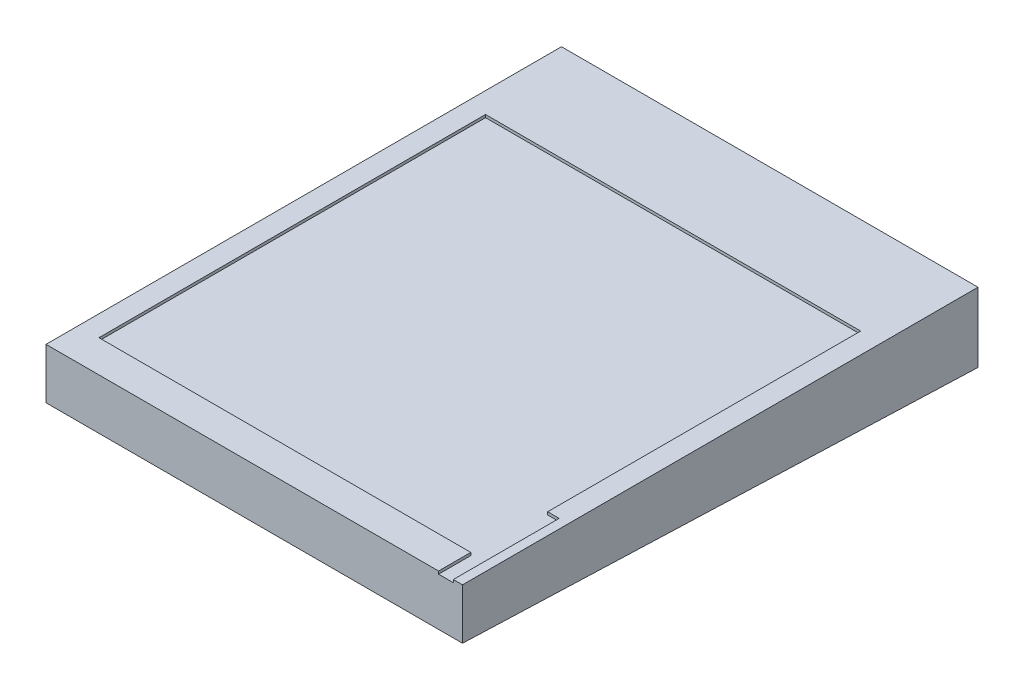
ISO-10303-21;
HEADER;
FILE_DESCRIPTION(('STEP AP214'),'2;1');
FILE_NAME('part.step','',(''),(''),'','','');
FILE_SCHEMA(('AUTOMOTIVE_DESIGN { 1 0 10303 214 1 1 1 1 }'));
ENDSEC;
DATA;
#1=APPLICATION_CONTEXT('core data for automotive mechanical design processes');
#2=APPLICATION_PROTOCOL_DEFINITION('international standard','automotive_design',2000,#1);
#3=PRODUCT_CONTEXT('',#1,'mechanical');
#4=PRODUCT('Part','Part','',(#3));
#5=PRODUCT_RELATED_PRODUCT_CATEGORY('part','',(#4));
#6=PRODUCT_DEFINITION_FORMATION('','',#4);
#7=PRODUCT_DEFINITION_CONTEXT('part definition',#1,'design');
#8=PRODUCT_DEFINITION('design','',#6,#7);
#9=PRODUCT_DEFINITION_SHAPE('','',#8);
#10=(LENGTH_UNIT() NAMED_UNIT(*) SI_UNIT(.MILLI.,.METRE.));
#11=(NAMED_UNIT(*) PLANE_ANGLE_UNIT() SI_UNIT($,.RADIAN.));
#12=(NAMED_UNIT(*) SI_UNIT($,.STERADIAN.) SOLID_ANGLE_UNIT());
#13=UNCERTAINTY_MEASURE_WITH_UNIT(LENGTH_MEASURE(1.E-05),#10,'distance_accuracy_value','');
#14=(GEOMETRIC_REPRESENTATION_CONTEXT(3) GLOBAL_UNCERTAINTY_ASSIGNED_CONTEXT((#13)) GLOBAL_UNIT_ASSIGNED_CONTEXT((#10,
#11,#12)) REPRESENTATION_CONTEXT('',''));
#15=CARTESIAN_POINT('',(0.,0.,0.));
#16=DIRECTION('',(0.,0.,1.));
#17=DIRECTION('',(1.,0.,0.));
#18=AXIS2_PLACEMENT_3D('',#15,#16,#17);
#19=CARTESIAN_POINT('',(90.5,0.,112.));
#20=DIRECTION('',(0.,-1.,0.));
#21=DIRECTION('',(0.,0.,-1.));
#22=AXIS2_PLACEMENT_3D('',#19,#20,#21);
#23=PLANE('',#22);
#24=DIRECTION('',(-1.,0.,0.));
#25=VECTOR('',#24,1.);
#26=CARTESIAN_POINT('',(90.5,0.,112.));
#27=LINE('',#26,#25);
#28=CARTESIAN_POINT('',(85.3,0.,112.));
#29=VERTEX_POINT('',#28);
#30=CARTESIAN_POINT('',(0.,0.,112.));
#31=VERTEX_POINT('',#30);
#32=EDGE_CURVE('E50',#29,#31,#27,.T.);
#33=ORIENTED_EDGE('',*,*,#32,.F.);
#34=DIRECTION('',(0.,0.,1.));
#35=VECTOR('',#34,1.);
#36=CARTESIAN_POINT('',(85.3,0.,112.));
#37=LINE('',#36,#35);
#38=CARTESIAN_POINT('',(85.3,0.,105.));
#39=VERTEX_POINT('',#38);
#40=EDGE_CURVE('E164',#39,#29,#37,.T.);
#41=ORIENTED_EDGE('',*,*,#40,.F.);
#42=DIRECTION('',(1.,0.,0.));
#43=VECTOR('',#42,1.);
#44=CARTESIAN_POINT('',(4.50000000000001,0.,105.));
#45=LINE('',#44,#43);
#46=CARTESIAN_POINT('',(4.50000000000002,0.,105.));
#47=VERTEX_POINT('',#46);
#48=EDGE_CURVE('E195',#47,#39,#45,.T.);
#49=ORIENTED_EDGE('',*,*,#48,.F.);
#50=DIRECTION('',(0.,0.,1.));
#51=VECTOR('',#50,1.);
#52=CARTESIAN_POINT('',(4.5,0.,21.));
#53=LINE('',#52,#51);
#54=CARTESIAN_POINT('',(4.5,0.,21.));
#55=VERTEX_POINT('',#54);
#56=EDGE_CURVE('E57',#55,#47,#53,.T.);
#57=ORIENTED_EDGE('',*,*,#56,.F.);
#58=DIRECTION('',(-1.,0.,0.));
#59=VECTOR('',#58,1.);
#60=CARTESIAN_POINT('',(4.5,0.,21.));
#61=LINE('',#60,#59);
#62=CARTESIAN_POINT('',(86.,0.,21.));
#63=VERTEX_POINT('',#62);
#64=EDGE_CURVE('E185',#63,#55,#61,.T.);
#65=ORIENTED_EDGE('',*,*,#64,.F.);
#66=DIRECTION('',(0.,0.,-1.));
#67=VECTOR('',#66,1.);
#68=CARTESIAN_POINT('',(86.,0.,21.));
#69=LINE('',#68,#67);
#70=CARTESIAN_POINT('',(86.,0.,89.));
#71=VERTEX_POINT('',#70);
#72=EDGE_CURVE('E198',#71,#63,#69,.T.);
#73=ORIENTED_EDGE('',*,*,#72,.F.);
#74=DIRECTION('',(-1.,0.,0.));
#75=VECTOR('',#74,1.);
#76=CARTESIAN_POINT('',(88.5,0.,89.));
#77=LINE('',#76,#75);
#78=CARTESIAN_POINT('',(88.5,0.,89.));
#79=VERTEX_POINT('',#78);
#80=EDGE_CURVE('E166',#79,#71,#77,.T.);
#81=ORIENTED_EDGE('',*,*,#80,.F.);
#82=DIRECTION('',(0.,0.,-1.));
#83=VECTOR('',#82,1.);
#84=CARTESIAN_POINT('',(88.5,0.,112.));
#85=LINE('',#84,#83);
#86=CARTESIAN_POINT('',(88.5,0.,112.));
#87=VERTEX_POINT('',#86);
#88=EDGE_CURVE('E146',#87,#79,#85,.T.);
#89=ORIENTED_EDGE('',*,*,#88,.F.);
#90=CARTESIAN_POINT('',(90.5,0.,112.));
#91=VERTEX_POINT('',#90);
#92=EDGE_CURVE('E11',#91,#87,#27,.T.);
#93=ORIENTED_EDGE('',*,*,#92,.F.);
#94=DIRECTION('',(0.,0.,1.));
#95=VECTOR('',#94,1.);
#96=CARTESIAN_POINT('',(90.5,0.,112.));
#97=LINE('',#96,#95);
#98=CARTESIAN_POINT('',(90.5,0.,0.));
#99=VERTEX_POINT('',#98);
#100=EDGE_CURVE('E209',#99,#91,#97,.T.);
#101=ORIENTED_EDGE('',*,*,#100,.F.);
#102=DIRECTION('',(-1.,0.,0.));
#103=VECTOR('',#102,1.);
#104=CARTESIAN_POINT('',(90.5,0.,0.));
#105=LINE('',#104,#103);
#106=CARTESIAN_POINT('',(0.,0.,0.));
#107=VERTEX_POINT('',#106);
#108=EDGE_CURVE('E215',#99,#107,#105,.T.);
#109=ORIENTED_EDGE('',*,*,#108,.T.);
#110=DIRECTION('',(0.,0.,1.));
#111=VECTOR('',#110,1.);
#112=CARTESIAN_POINT('',(0.,0.,112.));
#113=LINE('',#112,#111);
#114=EDGE_CURVE('E204',#107,#31,#113,.T.);
#115=ORIENTED_EDGE('',*,*,#114,.T.);
#116=EDGE_LOOP('',(#33,#41,#49,#57,#65,#73,#81,#89,#93,#101,#109,#115));
#117=FACE_BOUND('',#116,.T.);
#118=ADVANCED_FACE('F43',(#117),#23,.F.);
#119=CARTESIAN_POINT('',(90.5,-11.,112.));
#120=DIRECTION('',(0.,0.,-1.));
#121=DIRECTION('',(-1.,0.,0.));
#122=AXIS2_PLACEMENT_3D('',#119,#120,#121);
#123=PLANE('',#122);
#124=ORIENTED_EDGE('',*,*,#92,.T.);
#125=DIRECTION('',(0.,1.,0.));
#126=VECTOR('',#125,1.);
#127=CARTESIAN_POINT('',(88.5,-0.6,112.));
#128=LINE('',#127,#126);
#129=CARTESIAN_POINT('',(88.5,-0.6,112.));
#130=VERTEX_POINT('',#129);
#131=EDGE_CURVE('E173',#130,#87,#128,.T.);
#132=ORIENTED_EDGE('',*,*,#131,.F.);
#133=DIRECTION('',(1.,0.,0.));
#134=VECTOR('',#133,1.);
#135=CARTESIAN_POINT('',(88.5,-0.6,112.));
#136=LINE('',#135,#134);
#137=CARTESIAN_POINT('',(85.3,-0.6,112.));
#138=VERTEX_POINT('',#137);
#139=EDGE_CURVE('E150',#138,#130,#136,.T.);
#140=ORIENTED_EDGE('',*,*,#139,.F.);
#141=DIRECTION('',(0.,1.,0.));
#142=VECTOR('',#141,1.);
#143=CARTESIAN_POINT('',(85.3,-0.6,112.));
#144=LINE('',#143,#142);
#145=EDGE_CURVE('E149',#138,#29,#144,.T.);
#146=ORIENTED_EDGE('',*,*,#145,.T.);
#147=ORIENTED_EDGE('',*,*,#32,.T.);
#148=DIRECTION('',(0.,-1.,0.));
#149=VECTOR('',#148,1.);
#150=CARTESIAN_POINT('',(0.,-11.,112.));
#151=LINE('',#150,#149);
#152=CARTESIAN_POINT('',(0.,-11.,112.));
#153=VERTEX_POINT('',#152);
#154=EDGE_CURVE('E218',#31,#153,#151,.T.);
#155=ORIENTED_EDGE('',*,*,#154,.T.);
#156=DIRECTION('',(-1.,0.,0.));
#157=VECTOR('',#156,1.);
#158=CARTESIAN_POINT('',(90.5,-11.,112.));
#159=LINE('',#158,#157);
#160=CARTESIAN_POINT('',(90.5,-11.,112.));
#161=VERTEX_POINT('',#160);
#162=EDGE_CURVE('E225',#161,#153,#159,.T.);
#163=ORIENTED_EDGE('',*,*,#162,.F.);
#164=DIRECTION('',(0.,-1.,0.));
#165=VECTOR('',#164,1.);
#166=CARTESIAN_POINT('',(90.5,-11.,112.));
#167=LINE('',#166,#165);
#168=EDGE_CURVE('E94',#91,#161,#167,.T.);
#169=ORIENTED_EDGE('',*,*,#168,.F.);
#170=EDGE_LOOP('',(#124,#132,#140,#146,#147,#155,#163,#169));
#171=FACE_BOUND('',#170,.T.);
#172=ADVANCED_FACE('F232',(#171),#123,.F.);
#173=CARTESIAN_POINT('',(90.5,-15.1,0.));
#174=DIRECTION('',(0.,0.999330631228077,-0.036582639178885));
#175=DIRECTION('',(0.,0.036582639178885,0.999330631228077));
#176=AXIS2_PLACEMENT_3D('',#173,#174,#175);
#177=PLANE('',#176);
#178=DIRECTION('',(0.,-0.036582639178885,-0.999330631228077));
#179=VECTOR('',#178,1.);
#180=CARTESIAN_POINT('',(0.,-15.1,0.));
#181=LINE('',#180,#179);
#182=CARTESIAN_POINT('',(0.,-15.1,0.));
#183=VERTEX_POINT('',#182);
#184=EDGE_CURVE('E220',#153,#183,#181,.T.);
#185=ORIENTED_EDGE('',*,*,#184,.T.);
#186=DIRECTION('',(-1.,0.,0.));
#187=VECTOR('',#186,1.);
#188=CARTESIAN_POINT('',(90.5,-15.1,0.));
#189=LINE('',#188,#187);
#190=CARTESIAN_POINT('',(90.5,-15.1,0.));
#191=VERTEX_POINT('',#190);
#192=EDGE_CURVE('E224',#191,#183,#189,.T.);
#193=ORIENTED_EDGE('',*,*,#192,.F.);
#194=DIRECTION('',(0.,-0.036582639178885,-0.999330631228077));
#195=VECTOR('',#194,1.);
#196=CARTESIAN_POINT('',(90.5,-15.1,0.));
#197=LINE('',#196,#195);
#198=EDGE_CURVE('E212',#161,#191,#197,.T.);
#199=ORIENTED_EDGE('',*,*,#198,.F.);
#200=ORIENTED_EDGE('',*,*,#162,.T.);
#201=EDGE_LOOP('',(#185,#193,#199,#200));
#202=FACE_BOUND('',#201,.T.);
#203=ADVANCED_FACE('F243',(#202),#177,.F.);
#204=CARTESIAN_POINT('',(90.5,0.,0.));
#205=DIRECTION('',(0.,0.,1.));
#206=DIRECTION('',(1.,0.,0.));
#207=AXIS2_PLACEMENT_3D('',#204,#205,#206);
#208=PLANE('',#207);
#209=DIRECTION('',(0.,1.,0.));
#210=VECTOR('',#209,1.);
#211=CARTESIAN_POINT('',(0.,0.,0.));
#212=LINE('',#211,#210);
#213=EDGE_CURVE('E87',#183,#107,#212,.T.);
#214=ORIENTED_EDGE('',*,*,#213,.T.);
#215=ORIENTED_EDGE('',*,*,#108,.F.);
#216=DIRECTION('',(0.,1.,0.));
#217=VECTOR('',#216,1.);
#218=CARTESIAN_POINT('',(90.5,0.,0.));
#219=LINE('',#218,#217);
#220=EDGE_CURVE('E66',#191,#99,#219,.T.);
#221=ORIENTED_EDGE('',*,*,#220,.F.);
#222=ORIENTED_EDGE('',*,*,#192,.T.);
#223=EDGE_LOOP('',(#214,#215,#221,#222));
#224=FACE_BOUND('',#223,.T.);
#225=ADVANCED_FACE('F241',(#224),#208,.F.);
#226=CARTESIAN_POINT('',(90.5,0.,0.));
#227=DIRECTION('',(-1.,0.,0.));
#228=DIRECTION('',(0.,0.,1.));
#229=AXIS2_PLACEMENT_3D('',#226,#227,#228);
#230=PLANE('',#229);
#231=ORIENTED_EDGE('',*,*,#100,.T.);
#232=ORIENTED_EDGE('',*,*,#168,.T.);
#233=ORIENTED_EDGE('',*,*,#198,.T.);
#234=ORIENTED_EDGE('',*,*,#220,.T.);
#235=EDGE_LOOP('',(#231,#232,#233,#234));
#236=FACE_BOUND('',#235,.T.);
#237=ADVANCED_FACE('F244',(#236),#230,.F.);
#238=CARTESIAN_POINT('',(0.,0.,0.));
#239=DIRECTION('',(-1.,0.,0.));
#240=DIRECTION('',(0.,0.,1.));
#241=AXIS2_PLACEMENT_3D('',#238,#239,#240);
#242=PLANE('',#241);
#243=ORIENTED_EDGE('',*,*,#114,.F.);
#244=ORIENTED_EDGE('',*,*,#213,.F.);
#245=ORIENTED_EDGE('',*,*,#184,.F.);
#246=ORIENTED_EDGE('',*,*,#154,.F.);
#247=EDGE_LOOP('',(#243,#244,#245,#246));
#248=FACE_BOUND('',#247,.T.);
#249=ADVANCED_FACE('F238',(#248),#242,.T.);
#250=CARTESIAN_POINT('',(4.5,-0.6,21.));
#251=DIRECTION('',(-1.,0.,0.));
#252=DIRECTION('',(0.,0.,1.));
#253=AXIS2_PLACEMENT_3D('',#250,#251,#252);
#254=PLANE('',#253);
#255=ORIENTED_EDGE('',*,*,#56,.T.);
#256=DIRECTION('',(0.,1.,0.));
#257=VECTOR('',#256,1.);
#258=CARTESIAN_POINT('',(4.50000000000001,-0.6,105.));
#259=LINE('',#258,#257);
#260=CARTESIAN_POINT('',(4.50000000000001,-0.6,105.));
#261=VERTEX_POINT('',#260);
#262=EDGE_CURVE('E193',#261,#47,#259,.T.);
#263=ORIENTED_EDGE('',*,*,#262,.F.);
#264=DIRECTION('',(0.,0.,1.));
#265=VECTOR('',#264,1.);
#266=CARTESIAN_POINT('',(4.5,-0.6,21.));
#267=LINE('',#266,#265);
#268=CARTESIAN_POINT('',(4.5,-0.6,21.));
#269=VERTEX_POINT('',#268);
#270=EDGE_CURVE('E181',#269,#261,#267,.T.);
#271=ORIENTED_EDGE('',*,*,#270,.F.);
#272=DIRECTION('',(0.,1.,0.));
#273=VECTOR('',#272,1.);
#274=CARTESIAN_POINT('',(4.5,-0.6,21.));
#275=LINE('',#274,#273);
#276=EDGE_CURVE('E202',#269,#55,#275,.T.);
#277=ORIENTED_EDGE('',*,*,#276,.T.);
#278=EDGE_LOOP('',(#255,#263,#271,#277));
#279=FACE_BOUND('',#278,.T.);
#280=ADVANCED_FACE('F254',(#279),#254,.F.);
#281=CARTESIAN_POINT('',(4.5,-0.6,21.));
#282=DIRECTION('',(0.,0.,-1.));
#283=DIRECTION('',(-1.,0.,0.));
#284=AXIS2_PLACEMENT_3D('',#281,#282,#283);
#285=PLANE('',#284);
#286=ORIENTED_EDGE('',*,*,#64,.T.);
#287=ORIENTED_EDGE('',*,*,#276,.F.);
#288=DIRECTION('',(-1.,0.,0.));
#289=VECTOR('',#288,1.);
#290=CARTESIAN_POINT('',(4.5,-0.6,21.));
#291=LINE('',#290,#289);
#292=CARTESIAN_POINT('',(86.,-0.6,21.));
#293=VERTEX_POINT('',#292);
#294=EDGE_CURVE('E190',#293,#269,#291,.T.);
#295=ORIENTED_EDGE('',*,*,#294,.F.);
#296=DIRECTION('',(0.,1.,0.));
#297=VECTOR('',#296,1.);
#298=CARTESIAN_POINT('',(86.,-0.6,21.));
#299=LINE('',#298,#297);
#300=EDGE_CURVE('E205',#293,#63,#299,.T.);
#301=ORIENTED_EDGE('',*,*,#300,.T.);
#302=EDGE_LOOP('',(#286,#287,#295,#301));
#303=FACE_BOUND('',#302,.T.);
#304=ADVANCED_FACE('F253',(#303),#285,.F.);
#305=CARTESIAN_POINT('',(86.,-0.6,21.));
#306=DIRECTION('',(1.,0.,0.));
#307=DIRECTION('',(0.,0.,-1.));
#308=AXIS2_PLACEMENT_3D('',#305,#306,#307);
#309=PLANE('',#308);
#310=DIRECTION('',(0.,0.,-1.));
#311=VECTOR('',#310,1.);
#312=CARTESIAN_POINT('',(86.,-0.6,21.));
#313=LINE('',#312,#311);
#314=CARTESIAN_POINT('',(86.,-0.6,89.));
#315=VERTEX_POINT('',#314);
#316=EDGE_CURVE('E188',#315,#293,#313,.T.);
#317=ORIENTED_EDGE('',*,*,#316,.F.);
#318=DIRECTION('',(0.,1.,0.));
#319=VECTOR('',#318,1.);
#320=CARTESIAN_POINT('',(86.,-0.6,89.));
#321=LINE('',#320,#319);
#322=EDGE_CURVE('E156',#315,#71,#321,.T.);
#323=ORIENTED_EDGE('',*,*,#322,.T.);
#324=ORIENTED_EDGE('',*,*,#72,.T.);
#325=ORIENTED_EDGE('',*,*,#300,.F.);
#326=EDGE_LOOP('',(#317,#323,#324,#325));
#327=FACE_BOUND('',#326,.T.);
#328=ADVANCED_FACE('F248',(#327),#309,.F.);
#329=CARTESIAN_POINT('',(4.50000000000001,-0.6,105.));
#330=DIRECTION('',(0.,0.,1.));
#331=DIRECTION('',(1.,0.,0.));
#332=AXIS2_PLACEMENT_3D('',#329,#330,#331);
#333=PLANE('',#332);
#334=ORIENTED_EDGE('',*,*,#48,.T.);
#335=DIRECTION('',(0.,-1.,0.));
#336=VECTOR('',#335,1.);
#337=CARTESIAN_POINT('',(85.3,-0.6,105.));
#338=LINE('',#337,#336);
#339=CARTESIAN_POINT('',(85.3,-0.6,105.));
#340=VERTEX_POINT('',#339);
#341=EDGE_CURVE('E178',#39,#340,#338,.T.);
#342=ORIENTED_EDGE('',*,*,#341,.T.);
#343=DIRECTION('',(1.,0.,0.));
#344=VECTOR('',#343,1.);
#345=CARTESIAN_POINT('',(4.50000000000001,-0.6,105.));
#346=LINE('',#345,#344);
#347=EDGE_CURVE('E184',#261,#340,#346,.T.);
#348=ORIENTED_EDGE('',*,*,#347,.F.);
#349=ORIENTED_EDGE('',*,*,#262,.T.);
#350=EDGE_LOOP('',(#334,#342,#348,#349));
#351=FACE_BOUND('',#350,.T.);
#352=ADVANCED_FACE('F258',(#351),#333,.F.);
#353=CARTESIAN_POINT('',(0.,-0.6,0.));
#354=DIRECTION('',(0.,1.,0.));
#355=DIRECTION('',(0.,0.,1.));
#356=AXIS2_PLACEMENT_3D('',#353,#354,#355);
#357=PLANE('',#356);
#358=DIRECTION('',(-1.,0.,0.));
#359=VECTOR('',#358,1.);
#360=CARTESIAN_POINT('',(88.5,-0.6,89.));
#361=LINE('',#360,#359);
#362=CARTESIAN_POINT('',(88.5,-0.6,89.));
#363=VERTEX_POINT('',#362);
#364=EDGE_CURVE('E153',#363,#315,#361,.T.);
#365=ORIENTED_EDGE('',*,*,#364,.T.);
#366=ORIENTED_EDGE('',*,*,#316,.T.);
#367=ORIENTED_EDGE('',*,*,#294,.T.);
#368=ORIENTED_EDGE('',*,*,#270,.T.);
#369=ORIENTED_EDGE('',*,*,#347,.T.);
#370=DIRECTION('',(0.,0.,1.));
#371=VECTOR('',#370,1.);
#372=CARTESIAN_POINT('',(85.3,-0.6,112.));
#373=LINE('',#372,#371);
#374=EDGE_CURVE('E159',#340,#138,#373,.T.);
#375=ORIENTED_EDGE('',*,*,#374,.T.);
#376=ORIENTED_EDGE('',*,*,#139,.T.);
#377=DIRECTION('',(0.,0.,-1.));
#378=VECTOR('',#377,1.);
#379=CARTESIAN_POINT('',(88.5,-0.6,112.));
#380=LINE('',#379,#378);
#381=EDGE_CURVE('E143',#130,#363,#380,.T.);
#382=ORIENTED_EDGE('',*,*,#381,.T.);
#383=EDGE_LOOP('',(#365,#366,#367,#368,#369,#375,#376,#382));
#384=FACE_BOUND('',#383,.T.);
#385=ADVANCED_FACE('F161',(#384),#357,.T.);
#386=CARTESIAN_POINT('',(85.3,-0.6,112.));
#387=DIRECTION('',(-1.,0.,0.));
#388=DIRECTION('',(0.,0.,1.));
#389=AXIS2_PLACEMENT_3D('',#386,#387,#388);
#390=PLANE('',#389);
#391=ORIENTED_EDGE('',*,*,#40,.T.);
#392=ORIENTED_EDGE('',*,*,#145,.F.);
#393=ORIENTED_EDGE('',*,*,#374,.F.);
#394=ORIENTED_EDGE('',*,*,#341,.F.);
#395=EDGE_LOOP('',(#391,#392,#393,#394));
#396=FACE_BOUND('',#395,.T.);
#397=ADVANCED_FACE('F260',(#396),#390,.F.);
#398=CARTESIAN_POINT('',(88.5,-0.6,89.));
#399=DIRECTION('',(0.,0.,-1.));
#400=DIRECTION('',(-1.,0.,0.));
#401=AXIS2_PLACEMENT_3D('',#398,#399,#400);
#402=PLANE('',#401);
#403=ORIENTED_EDGE('',*,*,#364,.F.);
#404=DIRECTION('',(0.,1.,0.));
#405=VECTOR('',#404,1.);
#406=CARTESIAN_POINT('',(88.5,-0.6,89.));
#407=LINE('',#406,#405);
#408=EDGE_CURVE('E139',#363,#79,#407,.T.);
#409=ORIENTED_EDGE('',*,*,#408,.T.);
#410=ORIENTED_EDGE('',*,*,#80,.T.);
#411=ORIENTED_EDGE('',*,*,#322,.F.);
#412=EDGE_LOOP('',(#403,#409,#410,#411));
#413=FACE_BOUND('',#412,.T.);
#414=ADVANCED_FACE('F154',(#413),#402,.F.);
#415=CARTESIAN_POINT('',(88.5,-0.6,112.));
#416=DIRECTION('',(1.,0.,0.));
#417=DIRECTION('',(0.,0.,-1.));
#418=AXIS2_PLACEMENT_3D('',#415,#416,#417);
#419=PLANE('',#418);
#420=ORIENTED_EDGE('',*,*,#88,.T.);
#421=ORIENTED_EDGE('',*,*,#408,.F.);
#422=ORIENTED_EDGE('',*,*,#381,.F.);
#423=ORIENTED_EDGE('',*,*,#131,.T.);
#424=EDGE_LOOP('',(#420,#421,#422,#423));
#425=FACE_BOUND('',#424,.T.);
#426=ADVANCED_FACE('F141',(#425),#419,.F.);
#427=CLOSED_SHELL('',(#118,#172,#203,#225,#237,#249,#280,#304,#328,#352,#385,#397,#414,#426));
#428=MANIFOLD_SOLID_BREP('B2',#427);
#429=ADVANCED_BREP_SHAPE_REPRESENTATION('',(#18,#428),#14);
#430=SHAPE_DEFINITION_REPRESENTATION(#9,#429);
ENDSEC;
END-ISO-10303-21;
